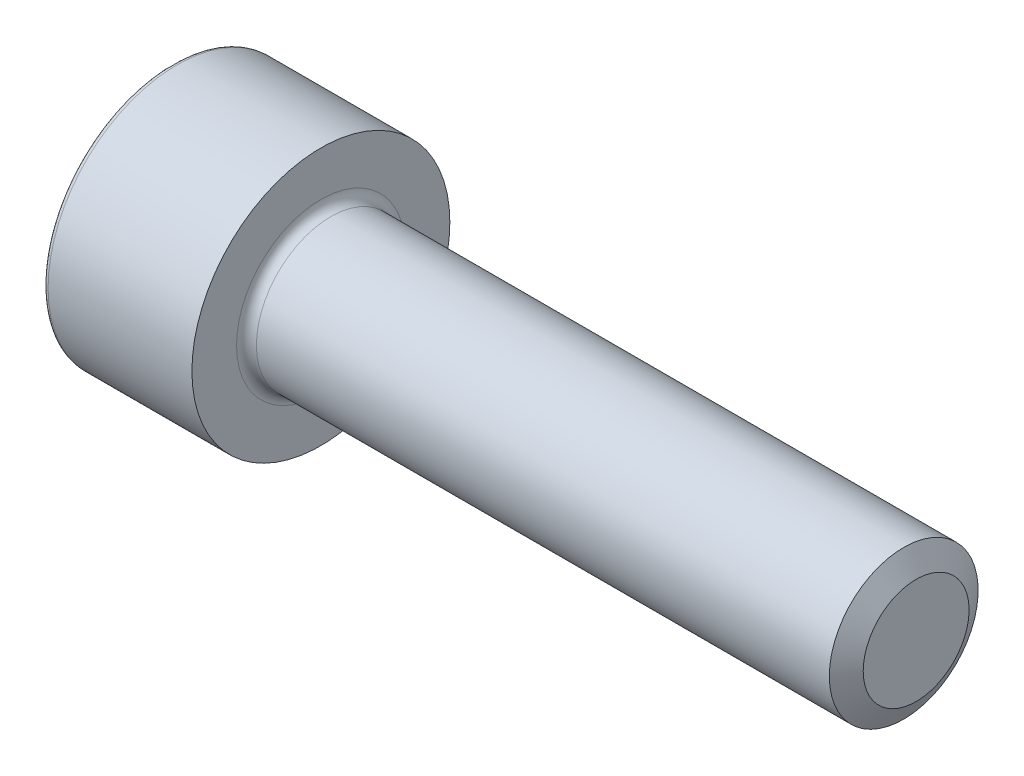
ISO-10303-21;
HEADER;
FILE_DESCRIPTION(('STEP AP214'),'2;1');
FILE_NAME('part.step','',(''),(''),'','','');
FILE_SCHEMA(('AUTOMOTIVE_DESIGN { 1 0 10303 214 1 1 1 1 }'));
ENDSEC;
DATA;
#1=APPLICATION_CONTEXT('core data for automotive mechanical design processes');
#2=APPLICATION_PROTOCOL_DEFINITION('international standard','automotive_design',2000,#1);
#3=PRODUCT_CONTEXT('',#1,'mechanical');
#4=PRODUCT('Part','Part','',(#3));
#5=PRODUCT_RELATED_PRODUCT_CATEGORY('part','',(#4));
#6=PRODUCT_DEFINITION_FORMATION('','',#4);
#7=PRODUCT_DEFINITION_CONTEXT('part definition',#1,'design');
#8=PRODUCT_DEFINITION('design','',#6,#7);
#9=PRODUCT_DEFINITION_SHAPE('','',#8);
#10=(LENGTH_UNIT() NAMED_UNIT(*) SI_UNIT(.MILLI.,.METRE.));
#11=(NAMED_UNIT(*) PLANE_ANGLE_UNIT() SI_UNIT($,.RADIAN.));
#12=(NAMED_UNIT(*) SI_UNIT($,.STERADIAN.) SOLID_ANGLE_UNIT());
#13=UNCERTAINTY_MEASURE_WITH_UNIT(LENGTH_MEASURE(1.E-05),#10,'distance_accuracy_value','');
#14=(GEOMETRIC_REPRESENTATION_CONTEXT(3) GLOBAL_UNCERTAINTY_ASSIGNED_CONTEXT((#13)) GLOBAL_UNIT_ASSIGNED_CONTEXT((#10,
#11,#12)) REPRESENTATION_CONTEXT('',''));
#15=CARTESIAN_POINT('',(0.,0.,0.));
#16=DIRECTION('',(0.,0.,1.));
#17=DIRECTION('',(1.,0.,0.));
#18=AXIS2_PLACEMENT_3D('',#15,#16,#17);
#19=CARTESIAN_POINT('',(0.,0.,0.));
#20=DIRECTION('',(-1.,0.,0.));
#21=DIRECTION('',(0.,0.,1.));
#22=AXIS2_PLACEMENT_3D('',#19,#20,#21);
#23=CYLINDRICAL_SURFACE('',#22,1.5);
#24=CARTESIAN_POINT('',(3.2,0.,0.));
#25=DIRECTION('',(-1.,0.,0.));
#26=DIRECTION('',(0.,0.,1.));
#27=AXIS2_PLACEMENT_3D('',#24,#25,#26);
#28=CIRCLE('',#27,1.5);
#29=CARTESIAN_POINT('',(3.2,0.,1.5));
#30=VERTEX_POINT('',#29);
#31=EDGE_CURVE('E141',#30,#30,#28,.T.);
#32=ORIENTED_EDGE('',*,*,#31,.F.);
#33=EDGE_LOOP('',(#32));
#34=FACE_BOUND('',#33,.T.);
#35=CARTESIAN_POINT('',(14.7500073334409,0.,0.));
#36=DIRECTION('',(-1.,0.,0.));
#37=DIRECTION('',(0.,0.,1.));
#38=AXIS2_PLACEMENT_3D('',#35,#36,#37);
#39=CIRCLE('',#38,1.5);
#40=CARTESIAN_POINT('',(14.7500073334409,0.,1.5));
#41=VERTEX_POINT('',#40);
#42=EDGE_CURVE('E278',#41,#41,#39,.T.);
#43=ORIENTED_EDGE('',*,*,#42,.T.);
#44=EDGE_LOOP('',(#43));
#45=FACE_BOUND('',#44,.T.);
#46=ADVANCED_FACE('F38',(#34,#45),#23,.T.);
#47=CARTESIAN_POINT('',(0.,0.,0.));
#48=DIRECTION('',(1.,0.,0.));
#49=DIRECTION('',(0.,0.,-1.));
#50=AXIS2_PLACEMENT_3D('',#47,#48,#49);
#51=PLANE('',#50);
#52=CARTESIAN_POINT('',(0.,0.,0.));
#53=DIRECTION('',(1.,0.,0.));
#54=DIRECTION('',(0.,0.,-1.));
#55=AXIS2_PLACEMENT_3D('',#52,#53,#54);
#56=CIRCLE('',#55,2.5);
#57=CARTESIAN_POINT('',(0.,0.,-2.5));
#58=VERTEX_POINT('',#57);
#59=EDGE_CURVE('E46',#58,#58,#56,.F.);
#60=ORIENTED_EDGE('',*,*,#59,.T.);
#61=EDGE_LOOP('',(#60));
#62=FACE_BOUND('',#61,.T.);
#63=DIRECTION('',(0.,0.866025403784439,-0.5));
#64=VECTOR('',#63,1.);
#65=CARTESIAN_POINT('',(0.,0.,1.435));
#66=LINE('',#65,#64);
#67=CARTESIAN_POINT('',(0.,0.,1.435));
#68=VERTEX_POINT('',#67);
#69=CARTESIAN_POINT('',(0.,1.24274645443067,0.717499999999999));
#70=VERTEX_POINT('',#69);
#71=EDGE_CURVE('E127',#68,#70,#66,.T.);
#72=ORIENTED_EDGE('',*,*,#71,.F.);
#73=DIRECTION('',(0.,0.866025403784439,0.5));
#74=VECTOR('',#73,1.);
#75=CARTESIAN_POINT('',(0.,-1.24274645443067,0.7175));
#76=LINE('',#75,#74);
#77=CARTESIAN_POINT('',(0.,-1.24274645443067,0.7175));
#78=VERTEX_POINT('',#77);
#79=EDGE_CURVE('E53',#78,#68,#76,.T.);
#80=ORIENTED_EDGE('',*,*,#79,.F.);
#81=DIRECTION('',(0.,0.,1.));
#82=VECTOR('',#81,1.);
#83=CARTESIAN_POINT('',(0.,-1.24274645443067,-0.7175));
#84=LINE('',#83,#82);
#85=CARTESIAN_POINT('',(0.,-1.24274645443067,-0.7175));
#86=VERTEX_POINT('',#85);
#87=EDGE_CURVE('E137',#86,#78,#84,.T.);
#88=ORIENTED_EDGE('',*,*,#87,.F.);
#89=DIRECTION('',(0.,-0.866025403784439,0.5));
#90=VECTOR('',#89,1.);
#91=CARTESIAN_POINT('',(0.,0.,-1.435));
#92=LINE('',#91,#90);
#93=CARTESIAN_POINT('',(0.,0.,-1.435));
#94=VERTEX_POINT('',#93);
#95=EDGE_CURVE('E135',#94,#86,#92,.T.);
#96=ORIENTED_EDGE('',*,*,#95,.F.);
#97=DIRECTION('',(0.,-0.866025403784439,-0.5));
#98=VECTOR('',#97,1.);
#99=CARTESIAN_POINT('',(0.,1.24274645443067,-0.7175));
#100=LINE('',#99,#98);
#101=CARTESIAN_POINT('',(0.,1.24274645443067,-0.7175));
#102=VERTEX_POINT('',#101);
#103=EDGE_CURVE('E101',#102,#94,#100,.T.);
#104=ORIENTED_EDGE('',*,*,#103,.F.);
#105=DIRECTION('',(0.,0.,-1.));
#106=VECTOR('',#105,1.);
#107=CARTESIAN_POINT('',(0.,1.24274645443067,0.717499999999999));
#108=LINE('',#107,#106);
#109=EDGE_CURVE('E131',#70,#102,#108,.T.);
#110=ORIENTED_EDGE('',*,*,#109,.F.);
#111=EDGE_LOOP('',(#72,#80,#88,#96,#104,#110));
#112=FACE_BOUND('',#111,.T.);
#113=ADVANCED_FACE('F158',(#62,#112),#51,.F.);
#114=CARTESIAN_POINT('',(0.,0.,0.));
#115=DIRECTION('',(-1.,0.,0.));
#116=DIRECTION('',(0.,0.,1.));
#117=AXIS2_PLACEMENT_3D('',#114,#115,#116);
#118=CYLINDRICAL_SURFACE('',#117,2.6);
#119=CARTESIAN_POINT('',(0.1,0.,0.));
#120=DIRECTION('',(1.,0.,0.));
#121=DIRECTION('',(0.,0.,-1.));
#122=AXIS2_PLACEMENT_3D('',#119,#120,#121);
#123=CIRCLE('',#122,2.6);
#124=CARTESIAN_POINT('',(0.1,0.,-2.6));
#125=VERTEX_POINT('',#124);
#126=EDGE_CURVE('E11',#125,#125,#123,.T.);
#127=ORIENTED_EDGE('',*,*,#126,.T.);
#128=EDGE_LOOP('',(#127));
#129=FACE_BOUND('',#128,.T.);
#130=CARTESIAN_POINT('',(3.,0.,0.));
#131=DIRECTION('',(-1.,0.,0.));
#132=DIRECTION('',(0.,0.,1.));
#133=AXIS2_PLACEMENT_3D('',#130,#131,#132);
#134=CIRCLE('',#133,2.6);
#135=CARTESIAN_POINT('',(3.,0.,2.6));
#136=VERTEX_POINT('',#135);
#137=EDGE_CURVE('E152',#136,#136,#134,.T.);
#138=ORIENTED_EDGE('',*,*,#137,.T.);
#139=EDGE_LOOP('',(#138));
#140=FACE_BOUND('',#139,.T.);
#141=ADVANCED_FACE('F177',(#129,#140),#118,.T.);
#142=CARTESIAN_POINT('',(3.,2.6,0.));
#143=DIRECTION('',(-1.,0.,0.));
#144=DIRECTION('',(0.,0.,1.));
#145=AXIS2_PLACEMENT_3D('',#142,#143,#144);
#146=PLANE('',#145);
#147=ORIENTED_EDGE('',*,*,#137,.F.);
#148=EDGE_LOOP('',(#147));
#149=FACE_BOUND('',#148,.T.);
#150=CARTESIAN_POINT('',(3.,0.,0.));
#151=DIRECTION('',(-1.,0.,0.));
#152=DIRECTION('',(0.,0.,1.));
#153=AXIS2_PLACEMENT_3D('',#150,#151,#152);
#154=CIRCLE('',#153,1.7);
#155=CARTESIAN_POINT('',(3.,0.,1.7));
#156=VERTEX_POINT('',#155);
#157=EDGE_CURVE('E149',#156,#156,#154,.T.);
#158=ORIENTED_EDGE('',*,*,#157,.T.);
#159=EDGE_LOOP('',(#158));
#160=FACE_BOUND('',#159,.T.);
#161=ADVANCED_FACE('F186',(#149,#160),#146,.F.);
#162=CARTESIAN_POINT('',(3.2,0.,0.));
#163=DIRECTION('',(-1.,0.,0.));
#164=DIRECTION('',(0.,0.,1.));
#165=AXIS2_PLACEMENT_3D('',#162,#163,#164);
#166=TOROIDAL_SURFACE('',#165,1.7,0.2);
#167=ORIENTED_EDGE('',*,*,#157,.F.);
#168=EDGE_LOOP('',(#167));
#169=FACE_BOUND('',#168,.T.);
#170=ORIENTED_EDGE('',*,*,#31,.T.);
#171=EDGE_LOOP('',(#170));
#172=FACE_BOUND('',#171,.T.);
#173=ADVANCED_FACE('F182',(#169,#172),#166,.F.);
#174=CARTESIAN_POINT('',(1.3,-1.24274645443067,0.7175));
#175=DIRECTION('',(0.,-0.5,0.866025403784439));
#176=DIRECTION('',(0.,-0.866025403784439,-0.5));
#177=AXIS2_PLACEMENT_3D('',#174,#175,#176);
#178=PLANE('',#177);
#179=ORIENTED_EDGE('',*,*,#79,.T.);
#180=DIRECTION('',(-1.,0.,0.));
#181=VECTOR('',#180,1.);
#182=CARTESIAN_POINT('',(1.3,0.,1.435));
#183=LINE('',#182,#181);
#184=CARTESIAN_POINT('',(1.3,0.,1.435));
#185=VERTEX_POINT('',#184);
#186=EDGE_CURVE('E83',#185,#68,#183,.T.);
#187=ORIENTED_EDGE('',*,*,#186,.F.);
#188=DIRECTION('',(0.,0.866025403784439,0.5));
#189=VECTOR('',#188,1.);
#190=CARTESIAN_POINT('',(1.3,-1.24274645443067,0.7175));
#191=LINE('',#190,#189);
#192=CARTESIAN_POINT('',(1.3,-1.24274645443067,0.7175));
#193=VERTEX_POINT('',#192);
#194=EDGE_CURVE('E139',#193,#185,#191,.T.);
#195=ORIENTED_EDGE('',*,*,#194,.F.);
#196=DIRECTION('',(-1.,0.,0.));
#197=VECTOR('',#196,1.);
#198=CARTESIAN_POINT('',(1.3,-1.24274645443067,0.7175));
#199=LINE('',#198,#197);
#200=EDGE_CURVE('E61',#193,#78,#199,.T.);
#201=ORIENTED_EDGE('',*,*,#200,.T.);
#202=EDGE_LOOP('',(#179,#187,#195,#201));
#203=FACE_BOUND('',#202,.T.);
#204=ADVANCED_FACE('F185',(#203),#178,.F.);
#205=CARTESIAN_POINT('',(1.3,-1.24274645443067,-0.7175));
#206=DIRECTION('',(0.,-1.,0.));
#207=DIRECTION('',(0.,0.,-1.));
#208=AXIS2_PLACEMENT_3D('',#205,#206,#207);
#209=PLANE('',#208);
#210=ORIENTED_EDGE('',*,*,#87,.T.);
#211=ORIENTED_EDGE('',*,*,#200,.F.);
#212=DIRECTION('',(0.,0.,1.));
#213=VECTOR('',#212,1.);
#214=CARTESIAN_POINT('',(1.3,-1.24274645443067,-0.7175));
#215=LINE('',#214,#213);
#216=CARTESIAN_POINT('',(1.3,-1.24274645443067,-0.7175));
#217=VERTEX_POINT('',#216);
#218=EDGE_CURVE('E113',#217,#193,#215,.T.);
#219=ORIENTED_EDGE('',*,*,#218,.F.);
#220=DIRECTION('',(-1.,0.,0.));
#221=VECTOR('',#220,1.);
#222=CARTESIAN_POINT('',(1.3,-1.24274645443067,-0.7175));
#223=LINE('',#222,#221);
#224=EDGE_CURVE('E105',#217,#86,#223,.T.);
#225=ORIENTED_EDGE('',*,*,#224,.T.);
#226=EDGE_LOOP('',(#210,#211,#219,#225));
#227=FACE_BOUND('',#226,.T.);
#228=ADVANCED_FACE('F216',(#227),#209,.F.);
#229=CARTESIAN_POINT('',(1.3,0.,-1.435));
#230=DIRECTION('',(0.,-0.5,-0.866025403784439));
#231=DIRECTION('',(0.,0.866025403784439,-0.5));
#232=AXIS2_PLACEMENT_3D('',#229,#230,#231);
#233=PLANE('',#232);
#234=ORIENTED_EDGE('',*,*,#95,.T.);
#235=ORIENTED_EDGE('',*,*,#224,.F.);
#236=DIRECTION('',(0.,-0.866025403784439,0.5));
#237=VECTOR('',#236,1.);
#238=CARTESIAN_POINT('',(1.3,0.,-1.435));
#239=LINE('',#238,#237);
#240=CARTESIAN_POINT('',(1.3,0.,-1.435));
#241=VERTEX_POINT('',#240);
#242=EDGE_CURVE('E109',#241,#217,#239,.T.);
#243=ORIENTED_EDGE('',*,*,#242,.F.);
#244=DIRECTION('',(-1.,0.,0.));
#245=VECTOR('',#244,1.);
#246=CARTESIAN_POINT('',(1.3,0.,-1.435));
#247=LINE('',#246,#245);
#248=EDGE_CURVE('E94',#241,#94,#247,.T.);
#249=ORIENTED_EDGE('',*,*,#248,.T.);
#250=EDGE_LOOP('',(#234,#235,#243,#249));
#251=FACE_BOUND('',#250,.T.);
#252=ADVANCED_FACE('F110',(#251),#233,.F.);
#253=CARTESIAN_POINT('',(1.3,1.24274645443067,-0.7175));
#254=DIRECTION('',(0.,0.5,-0.866025403784439));
#255=DIRECTION('',(0.,0.866025403784439,0.5));
#256=AXIS2_PLACEMENT_3D('',#253,#254,#255);
#257=PLANE('',#256);
#258=ORIENTED_EDGE('',*,*,#103,.T.);
#259=ORIENTED_EDGE('',*,*,#248,.F.);
#260=DIRECTION('',(0.,-0.866025403784439,-0.5));
#261=VECTOR('',#260,1.);
#262=CARTESIAN_POINT('',(1.3,1.24274645443067,-0.7175));
#263=LINE('',#262,#261);
#264=CARTESIAN_POINT('',(1.3,1.24274645443067,-0.7175));
#265=VERTEX_POINT('',#264);
#266=EDGE_CURVE('E98',#265,#241,#263,.T.);
#267=ORIENTED_EDGE('',*,*,#266,.F.);
#268=DIRECTION('',(-1.,0.,0.));
#269=VECTOR('',#268,1.);
#270=CARTESIAN_POINT('',(1.3,1.24274645443067,-0.7175));
#271=LINE('',#270,#269);
#272=EDGE_CURVE('E106',#265,#102,#271,.T.);
#273=ORIENTED_EDGE('',*,*,#272,.T.);
#274=EDGE_LOOP('',(#258,#259,#267,#273));
#275=FACE_BOUND('',#274,.T.);
#276=ADVANCED_FACE('F96',(#275),#257,.F.);
#277=CARTESIAN_POINT('',(1.3,1.24274645443067,0.717499999999999));
#278=DIRECTION('',(0.,1.,0.));
#279=DIRECTION('',(0.,0.,1.));
#280=AXIS2_PLACEMENT_3D('',#277,#278,#279);
#281=PLANE('',#280);
#282=ORIENTED_EDGE('',*,*,#109,.T.);
#283=ORIENTED_EDGE('',*,*,#272,.F.);
#284=DIRECTION('',(0.,0.,-1.));
#285=VECTOR('',#284,1.);
#286=CARTESIAN_POINT('',(1.3,1.24274645443067,0.717499999999999));
#287=LINE('',#286,#285);
#288=CARTESIAN_POINT('',(1.3,1.24274645443067,0.717499999999999));
#289=VERTEX_POINT('',#288);
#290=EDGE_CURVE('E119',#289,#265,#287,.T.);
#291=ORIENTED_EDGE('',*,*,#290,.F.);
#292=DIRECTION('',(-1.,0.,0.));
#293=VECTOR('',#292,1.);
#294=CARTESIAN_POINT('',(1.3,1.24274645443067,0.717499999999999));
#295=LINE('',#294,#293);
#296=EDGE_CURVE('E144',#289,#70,#295,.T.);
#297=ORIENTED_EDGE('',*,*,#296,.T.);
#298=EDGE_LOOP('',(#282,#283,#291,#297));
#299=FACE_BOUND('',#298,.T.);
#300=ADVANCED_FACE('F234',(#299),#281,.F.);
#301=CARTESIAN_POINT('',(1.3,0.,1.435));
#302=DIRECTION('',(0.,0.5,0.866025403784439));
#303=DIRECTION('',(0.,-0.866025403784439,0.5));
#304=AXIS2_PLACEMENT_3D('',#301,#302,#303);
#305=PLANE('',#304);
#306=ORIENTED_EDGE('',*,*,#71,.T.);
#307=ORIENTED_EDGE('',*,*,#296,.F.);
#308=DIRECTION('',(0.,0.866025403784439,-0.5));
#309=VECTOR('',#308,1.);
#310=CARTESIAN_POINT('',(1.3,0.,1.435));
#311=LINE('',#310,#309);
#312=EDGE_CURVE('E121',#185,#289,#311,.T.);
#313=ORIENTED_EDGE('',*,*,#312,.F.);
#314=ORIENTED_EDGE('',*,*,#186,.T.);
#315=EDGE_LOOP('',(#306,#307,#313,#314));
#316=FACE_BOUND('',#315,.T.);
#317=ADVANCED_FACE('F241',(#316),#305,.F.);
#318=CARTESIAN_POINT('',(1.3,-1.24274645443067,0.7175));
#319=DIRECTION('',(1.,0.,0.));
#320=DIRECTION('',(0.,0.,-1.));
#321=AXIS2_PLACEMENT_3D('',#318,#319,#320);
#322=PLANE('',#321);
#323=ORIENTED_EDGE('',*,*,#194,.T.);
#324=ORIENTED_EDGE('',*,*,#312,.T.);
#325=ORIENTED_EDGE('',*,*,#290,.T.);
#326=ORIENTED_EDGE('',*,*,#266,.T.);
#327=ORIENTED_EDGE('',*,*,#242,.T.);
#328=ORIENTED_EDGE('',*,*,#218,.T.);
#329=EDGE_LOOP('',(#323,#324,#325,#326,#327,#328));
#330=FACE_BOUND('',#329,.T.);
#331=ADVANCED_FACE('F116',(#330),#322,.F.);
#332=CARTESIAN_POINT('',(14.7500073334409,0.,0.));
#333=DIRECTION('',(-1.,0.,0.));
#334=DIRECTION('',(0.,0.,1.));
#335=AXIS2_PLACEMENT_3D('',#332,#333,#334);
#336=CONICAL_SURFACE('',#335,1.5,1.04719755119659);
#337=CARTESIAN_POINT('',(15.,0.,0.));
#338=DIRECTION('',(-1.,0.,0.));
#339=DIRECTION('',(0.,0.,1.));
#340=AXIS2_PLACEMENT_3D('',#337,#338,#339);
#341=CIRCLE('',#340,1.067);
#342=CARTESIAN_POINT('',(15.,0.,1.067));
#343=VERTEX_POINT('',#342);
#344=EDGE_CURVE('E128',#343,#343,#341,.T.);
#345=ORIENTED_EDGE('',*,*,#344,.T.);
#346=EDGE_LOOP('',(#345));
#347=FACE_BOUND('',#346,.T.);
#348=ORIENTED_EDGE('',*,*,#42,.F.);
#349=EDGE_LOOP('',(#348));
#350=FACE_BOUND('',#349,.T.);
#351=ADVANCED_FACE('F167',(#347,#350),#336,.T.);
#352=CARTESIAN_POINT('',(15.,1.5,0.));
#353=DIRECTION('',(-1.,0.,0.));
#354=DIRECTION('',(0.,0.,1.));
#355=AXIS2_PLACEMENT_3D('',#352,#353,#354);
#356=PLANE('',#355);
#357=ORIENTED_EDGE('',*,*,#344,.F.);
#358=EDGE_LOOP('',(#357));
#359=FACE_BOUND('',#358,.T.);
#360=ADVANCED_FACE('F162',(#359),#356,.F.);
#361=CARTESIAN_POINT('',(0.1,0.,0.));
#362=DIRECTION('',(1.,0.,0.));
#363=DIRECTION('',(0.,0.,-1.));
#364=AXIS2_PLACEMENT_3D('',#361,#362,#363);
#365=TOROIDAL_SURFACE('',#364,2.5,0.1);
#366=ORIENTED_EDGE('',*,*,#126,.F.);
#367=EDGE_LOOP('',(#366));
#368=FACE_BOUND('',#367,.T.);
#369=ORIENTED_EDGE('',*,*,#59,.F.);
#370=EDGE_LOOP('',(#369));
#371=FACE_BOUND('',#370,.T.);
#372=ADVANCED_FACE('F40',(#368,#371),#365,.T.);
#373=CLOSED_SHELL('',(#46,#113,#141,#161,#173,#204,#228,#252,#276,#300,#317,#331,#351,#360,#372));
#374=MANIFOLD_SOLID_BREP('B2',#373);
#375=ADVANCED_BREP_SHAPE_REPRESENTATION('',(#18,#374),#14);
#376=SHAPE_DEFINITION_REPRESENTATION(#9,#375);
ENDSEC;
END-ISO-10303-21;
